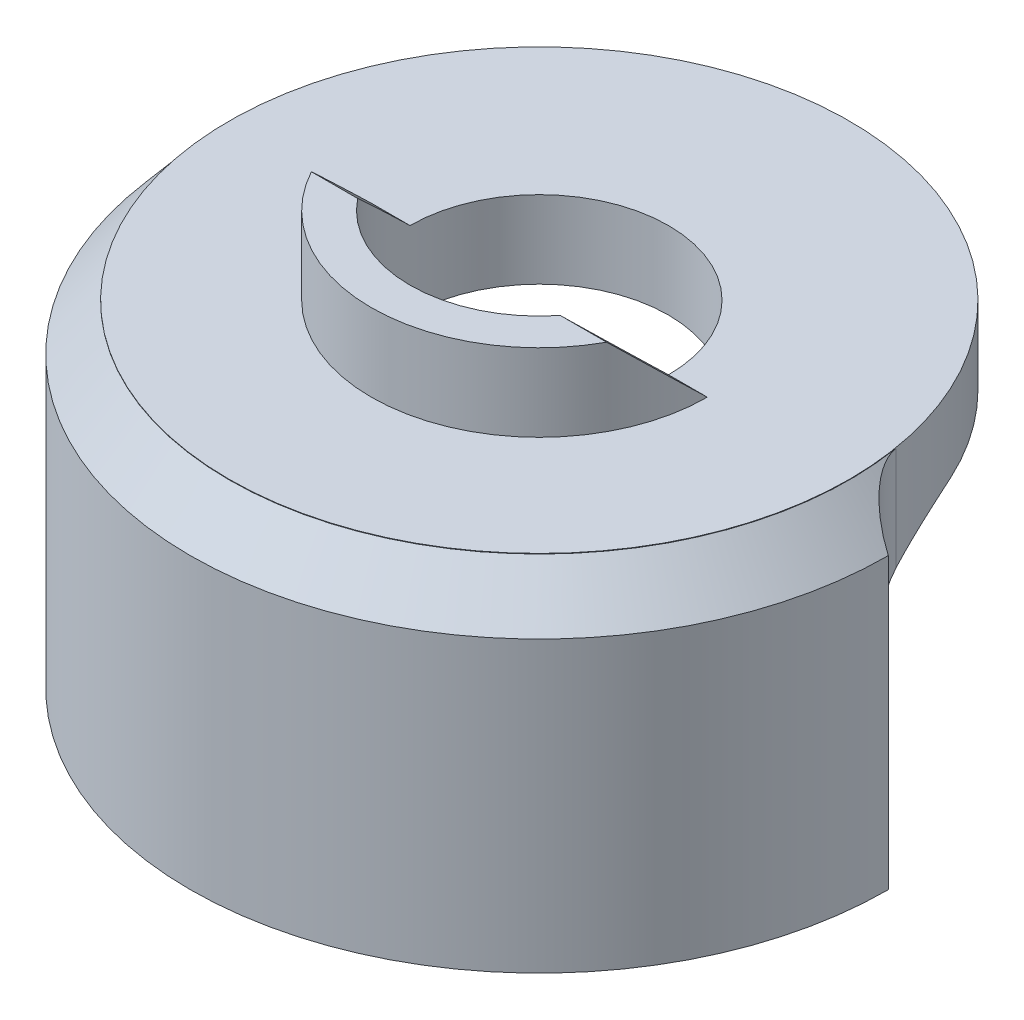
ISO-10303-21;
HEADER;
FILE_DESCRIPTION(('STEP AP214'),'2;1');
FILE_NAME('part.step','',(''),(''),'','','');
FILE_SCHEMA(('AUTOMOTIVE_DESIGN { 1 0 10303 214 1 1 1 1 }'));
ENDSEC;
DATA;
#1=APPLICATION_CONTEXT('core data for automotive mechanical design processes');
#2=APPLICATION_PROTOCOL_DEFINITION('international standard','automotive_design',2000,#1);
#3=PRODUCT_CONTEXT('',#1,'mechanical');
#4=PRODUCT('Part','Part','',(#3));
#5=PRODUCT_RELATED_PRODUCT_CATEGORY('part','',(#4));
#6=PRODUCT_DEFINITION_FORMATION('','',#4);
#7=PRODUCT_DEFINITION_CONTEXT('part definition',#1,'design');
#8=PRODUCT_DEFINITION('design','',#6,#7);
#9=PRODUCT_DEFINITION_SHAPE('','',#8);
#10=(LENGTH_UNIT() NAMED_UNIT(*) SI_UNIT(.MILLI.,.METRE.));
#11=(NAMED_UNIT(*) PLANE_ANGLE_UNIT() SI_UNIT($,.RADIAN.));
#12=(NAMED_UNIT(*) SI_UNIT($,.STERADIAN.) SOLID_ANGLE_UNIT());
#13=UNCERTAINTY_MEASURE_WITH_UNIT(LENGTH_MEASURE(1.E-05),#10,'distance_accuracy_value','');
#14=(GEOMETRIC_REPRESENTATION_CONTEXT(3) GLOBAL_UNCERTAINTY_ASSIGNED_CONTEXT((#13)) GLOBAL_UNIT_ASSIGNED_CONTEXT((#10,
#11,#12)) REPRESENTATION_CONTEXT('',''));
#15=CARTESIAN_POINT('',(0.,0.,0.));
#16=DIRECTION('',(0.,0.,1.));
#17=DIRECTION('',(1.,0.,0.));
#18=AXIS2_PLACEMENT_3D('',#15,#16,#17);
#19=CARTESIAN_POINT('',(0.,20.,0.));
#20=DIRECTION('',(0.,-1.,0.));
#21=DIRECTION('',(0.,0.,-1.));
#22=AXIS2_PLACEMENT_3D('',#19,#20,#21);
#23=CYLINDRICAL_SURFACE('',#22,20.);
#24=CARTESIAN_POINT('',(0.,0.,0.));
#25=DIRECTION('',(0.,-1.,0.));
#26=DIRECTION('',(0.,0.,-1.));
#27=AXIS2_PLACEMENT_3D('',#24,#25,#26);
#28=CIRCLE('',#27,20.);
#29=CARTESIAN_POINT('',(20.,0.,0.));
#30=VERTEX_POINT('',#29);
#31=CARTESIAN_POINT('',(-20.,0.,0.));
#32=VERTEX_POINT('',#31);
#33=EDGE_CURVE('E179',#30,#32,#28,.T.);
#34=ORIENTED_EDGE('',*,*,#33,.T.);
#35=DIRECTION('',(0.,-1.,0.));
#36=VECTOR('',#35,1.);
#37=CARTESIAN_POINT('',(-20.,20.,0.));
#38=LINE('',#37,#36);
#39=CARTESIAN_POINT('',(-20.,10.,0.));
#40=VERTEX_POINT('',#39);
#41=EDGE_CURVE('E212',#40,#32,#38,.T.);
#42=ORIENTED_EDGE('',*,*,#41,.F.);
#43=CARTESIAN_POINT('',(-20.,10.,0.));
#44=CARTESIAN_POINT('',(-19.9999557370953,10.2805626373853,2.99438579420407E-05));
#45=CARTESIAN_POINT('',(-19.9999986078176,10.5611210251892,-0.0118060572730352));
#46=CARTESIAN_POINT('',(-19.9999387337623,11.1202432263666,-0.0589939019382666));
#47=CARTESIAN_POINT('',(-19.9998359944431,11.3988071141145,-0.0943448639401672));
#48=CARTESIAN_POINT('',(-19.9991651639557,11.9518916713769,-0.188332355567513));
#49=CARTESIAN_POINT('',(-19.9985972139569,12.2264135417299,-0.246961818491314));
#50=CARTESIAN_POINT('',(-19.9963773522755,12.7695525530659,-0.387080348755986));
#51=CARTESIAN_POINT('',(-19.9947254540536,13.0381697673315,-0.468569132217736));
#52=CARTESIAN_POINT('',(-19.989522603102,13.5677616164803,-0.653886785261699));
#53=CARTESIAN_POINT('',(-19.9859704300935,13.8287312266746,-0.75772998429909));
#54=CARTESIAN_POINT('',(-19.9759617833958,14.3409674737002,-0.986968781670479));
#55=CARTESIAN_POINT('',(-19.9695053549892,14.5922342617499,-1.11236404394936));
#56=CARTESIAN_POINT('',(-19.9525359716774,15.0832085593254,-1.38375620847462));
#57=CARTESIAN_POINT('',(-19.9420234855485,15.3229174010533,-1.5297507287383));
#58=CARTESIAN_POINT('',(-19.9156807366992,15.7890239179821,-1.84121562157234));
#59=CARTESIAN_POINT('',(-19.8998505678017,16.0154218279526,-2.00668565049168));
#60=CARTESIAN_POINT('',(-19.8617485317303,16.4509585511862,-2.35396115093739));
#61=CARTESIAN_POINT('',(-19.8395441677449,16.6602501346368,-2.53558234570399));
#62=CARTESIAN_POINT('',(-19.7873511781658,17.0625518023257,-2.91502911047923));
#63=CARTESIAN_POINT('',(-19.7573625822775,17.2555619486918,-3.11285461864856));
#64=CARTESIAN_POINT('',(-19.6884046394683,17.6237303156232,-3.52276504570011));
#65=CARTESIAN_POINT('',(-19.6494418276717,17.7989013935786,-3.73483950912087));
#66=CARTESIAN_POINT('',(-19.5614292641474,18.1302973958213,-4.17133454832748));
#67=CARTESIAN_POINT('',(-19.5123799914951,18.286523219389,-4.3957545373687));
#68=CARTESIAN_POINT('',(-19.4055291021525,18.5730280044983,-4.8452651922289));
#69=CARTESIAN_POINT('',(-19.3481692420369,18.7041086431448,-5.06995042531682));
#70=CARTESIAN_POINT('',(-19.2227487020385,18.947317246645,-5.52647769706415));
#71=CARTESIAN_POINT('',(-19.154688097627,19.0594453451578,-5.75831968523834));
#72=CARTESIAN_POINT('',(-19.007432782435,19.2645281224053,-6.22719365358695));
#73=CARTESIAN_POINT('',(-18.9282267177046,19.3574630076423,-6.46423071549736));
#74=CARTESIAN_POINT('',(-18.7586219733123,19.5239993517451,-6.94104569878218));
#75=CARTESIAN_POINT('',(-18.6682242367918,19.597602438105,-7.18082338765561));
#76=CARTESIAN_POINT('',(-18.4852716379337,19.7198302561806,-7.63870144767883));
#77=CARTESIAN_POINT('',(-18.3936964321844,19.7701397092871,-7.85674735972424));
#78=CARTESIAN_POINT('',(-18.2016664772038,19.8555380220128,-8.29191863880495));
#79=CARTESIAN_POINT('',(-18.101211179975,19.8906259415087,-8.50904394816145));
#80=CARTESIAN_POINT('',(-17.8919969567306,19.9460956297941,-8.94056832620432));
#81=CARTESIAN_POINT('',(-17.7832558670354,19.9665080528281,-9.15497215325431));
#82=CARTESIAN_POINT('',(-17.5577747522793,19.9934653907493,-9.58033020860676));
#83=CARTESIAN_POINT('',(-17.4410375485944,20.0000151712221,-9.7912856214477));
#84=CARTESIAN_POINT('',(-17.3205080756888,20.,-10.));
#85=B_SPLINE_CURVE_WITH_KNOTS('',3,(#43,#44,#45,#46,#47,#48,#49,#50,#51,#52,#53,#54,#55,#56,#57,
#58,#59,#60,#61,#62,#63,#64,#65,#66,#67,#68,#69,#70,#71,#72,#73,#74,#75,#76,#77,#78,#79,#80,#81,
#82,#83,#84),.UNSPECIFIED.,.F.,.F.,(4,2,2,2,2,2,2,2,2,2,2,2,2,2,2,2,2,2,2,2,4),(0.,
0.841432372616263,1.68283320326807,2.5239788032209,3.36511395784561,4.20678990454419,
5.04845272842231,5.89001830677085,6.73156903767483,7.56451718005767,8.3974621438706,
9.22980245490532,10.0621032415009,10.8602498176647,11.6583907648246,12.4573507499772,
13.2562434511754,13.9809573838289,14.7057160704186,15.4289564442854,16.1519429291931),.UNSPECIFIED.);
#86=CARTESIAN_POINT('',(-17.3205080756888,20.,-10.));
#87=VERTEX_POINT('',#86);
#88=EDGE_CURVE('E309',#40,#87,#85,.T.);
#89=ORIENTED_EDGE('',*,*,#88,.T.);
#90=CARTESIAN_POINT('',(0.,20.,0.));
#91=DIRECTION('',(0.,-1.,0.));
#92=DIRECTION('',(0.,0.,-1.));
#93=AXIS2_PLACEMENT_3D('',#90,#91,#92);
#94=CIRCLE('',#93,20.);
#95=CARTESIAN_POINT('',(17.3205080756888,20.,-10.));
#96=VERTEX_POINT('',#95);
#97=EDGE_CURVE('E183',#96,#87,#94,.T.);
#98=ORIENTED_EDGE('',*,*,#97,.F.);
#99=CARTESIAN_POINT('',(17.3205080756888,20.,-10.));
#100=CARTESIAN_POINT('',(17.459612415594,20.0000289828941,-9.75915325547947));
#101=CARTESIAN_POINT('',(17.5936559303901,19.9912982661973,-9.51529333613806));
#102=CARTESIAN_POINT('',(17.8510321720107,19.9552269450601,-9.02315548704158));
#103=CARTESIAN_POINT('',(17.9743582486052,19.9278748776406,-8.77487492775037));
#104=CARTESIAN_POINT('',(18.2096966668275,19.853417275292,-8.27546730681568));
#105=CARTESIAN_POINT('',(18.3216934593926,19.8062850372674,-8.02433684540639));
#106=CARTESIAN_POINT('',(18.5336859705613,19.6914766887072,-7.52175613948921));
#107=CARTESIAN_POINT('',(18.633684333424,19.6238051163536,-7.27030597782845));
#108=CARTESIAN_POINT('',(18.8218407710521,19.4670902166285,-6.76834212011));
#109=CARTESIAN_POINT('',(18.9099483557127,19.3779599687156,-6.51783655304953));
#110=CARTESIAN_POINT('',(19.0738581333725,19.178327741808,-6.02131990188398));
#111=CARTESIAN_POINT('',(19.1496593574931,19.0678240815861,-5.7753091730089));
#112=CARTESIAN_POINT('',(19.2891545861386,18.8258796864667,-5.29074625413785));
#113=CARTESIAN_POINT('',(19.3528668826701,18.6944711461643,-5.05218325929775));
#114=CARTESIAN_POINT('',(19.4689275565784,18.4112143223625,-4.58463553736812));
#115=CARTESIAN_POINT('',(19.5212766296463,18.2593672910921,-4.35565022459722));
#116=CARTESIAN_POINT('',(19.6126912099352,17.9457410530995,-3.92280009919125));
#117=CARTESIAN_POINT('',(19.6523591542812,17.7850800902642,-3.71825052877837));
#118=CARTESIAN_POINT('',(19.7232936928387,17.4475068264008,-3.32149114715563));
#119=CARTESIAN_POINT('',(19.7545605865166,17.2705951049537,-3.12928089628083));
#120=CARTESIAN_POINT('',(19.8097149968838,16.9015743178438,-2.75868119688006));
#121=CARTESIAN_POINT('',(19.8335980592366,16.7094561662398,-2.58030013931035));
#122=CARTESIAN_POINT('',(19.8750343291867,16.3114025127017,-2.23888172518597));
#123=CARTESIAN_POINT('',(19.8925873914606,16.1054666936718,-2.07584472096174));
#124=CARTESIAN_POINT('',(19.9227019851648,15.6776728071139,-1.76378269350276));
#125=CARTESIAN_POINT('',(19.9351768619137,15.455608883857,-1.61503156933063));
#126=CARTESIAN_POINT('',(19.9558389477264,15.0001398792703,-1.33570692752737));
#127=CARTESIAN_POINT('',(19.9640260730185,14.7667345764565,-1.20513376508325));
#128=CARTESIAN_POINT('',(19.9771666714359,14.2901502617058,-0.963073362964122));
#129=CARTESIAN_POINT('',(19.9821201958237,14.0469714047744,-0.851585820744589));
#130=CARTESIAN_POINT('',(19.989743941604,13.5524334729352,-0.648439976445172));
#131=CARTESIAN_POINT('',(19.9924141652643,13.3010744061514,-0.556781654672759));
#132=CARTESIAN_POINT('',(19.9962189021077,12.8007565537338,-0.396755504012648));
#133=CARTESIAN_POINT('',(19.9974040220749,12.5520231169728,-0.327683189203374));
#134=CARTESIAN_POINT('',(19.9989958117031,12.0499618061518,-0.208973450337824));
#135=CARTESIAN_POINT('',(19.9994024966261,11.7966340222663,-0.159335645266042));
#136=CARTESIAN_POINT('',(19.9998827127155,11.2868679523363,-0.0797935346938616));
#137=CARTESIAN_POINT('',(19.9999562030292,11.0304292887339,-0.049891649383771));
#138=CARTESIAN_POINT('',(19.9999989843423,10.5159948291556,-0.00998366544209937));
#139=CARTESIAN_POINT('',(19.9999682696628,10.2579989490815,2.1348830103947E-05));
#140=CARTESIAN_POINT('',(20.,10.,0.));
#141=B_SPLINE_CURVE_WITH_KNOTS('',3,(#99,#100,#101,#102,#103,#104,#105,#106,#107,#108,#109,#110,
#111,#112,#113,#114,#115,#116,#117,#118,#119,#120,#121,#122,#123,#124,#125,#126,#127,#128,#129,
#130,#131,#132,#133,#134,#135,#136,#137,#138,#139,#140),.UNSPECIFIED.,.F.,.F.,(4,2,2,2,2,2,2,2,
2,2,2,2,2,2,2,2,2,2,2,2,4),(0.,0.834312350280989,1.66913875364591,2.50509581083416,
3.34086829694701,4.18008487221364,5.01936748690844,5.85736985767487,6.6953209089178,
7.48372262446205,8.27209623268631,9.06094450777076,9.84981089198667,10.6516249580703,
11.4534546889452,12.2552717080681,13.0570879308976,13.8307645145586,14.6044259294532,
15.378182199828,16.1519806379827),.UNSPECIFIED.);
#142=CARTESIAN_POINT('',(20.,10.,0.));
#143=VERTEX_POINT('',#142);
#144=EDGE_CURVE('E269',#96,#143,#141,.T.);
#145=ORIENTED_EDGE('',*,*,#144,.T.);
#146=DIRECTION('',(0.,-1.,0.));
#147=VECTOR('',#146,1.);
#148=CARTESIAN_POINT('',(20.,20.,0.));
#149=LINE('',#148,#147);
#150=EDGE_CURVE('E186',#143,#30,#149,.T.);
#151=ORIENTED_EDGE('',*,*,#150,.T.);
#152=EDGE_LOOP('',(#34,#42,#89,#98,#145,#151));
#153=FACE_BOUND('',#152,.T.);
#154=ADVANCED_FACE('F45',(#153),#23,.F.);
#155=CARTESIAN_POINT('',(-27.,20.,0.));
#156=DIRECTION('',(0.,0.,1.));
#157=DIRECTION('',(1.,0.,0.));
#158=AXIS2_PLACEMENT_3D('',#155,#156,#157);
#159=PLANE('',#158);
#160=DIRECTION('',(0.,-1.,0.));
#161=VECTOR('',#160,1.);
#162=CARTESIAN_POINT('',(-27.,20.,0.));
#163=LINE('',#162,#161);
#164=CARTESIAN_POINT('',(-27.,10.,0.));
#165=VERTEX_POINT('',#164);
#166=CARTESIAN_POINT('',(-27.,0.,0.));
#167=VERTEX_POINT('',#166);
#168=EDGE_CURVE('E208',#165,#167,#163,.T.);
#169=ORIENTED_EDGE('',*,*,#168,.F.);
#170=DIRECTION('',(-1.,0.,0.));
#171=VECTOR('',#170,1.);
#172=CARTESIAN_POINT('',(-20.,10.,0.));
#173=LINE('',#172,#171);
#174=EDGE_CURVE('E542',#165,#40,#173,.F.);
#175=ORIENTED_EDGE('',*,*,#174,.T.);
#176=ORIENTED_EDGE('',*,*,#41,.T.);
#177=DIRECTION('',(-1.,0.,0.));
#178=VECTOR('',#177,1.);
#179=CARTESIAN_POINT('',(-27.,0.,0.));
#180=LINE('',#179,#178);
#181=EDGE_CURVE('E191',#32,#167,#180,.T.);
#182=ORIENTED_EDGE('',*,*,#181,.T.);
#183=EDGE_LOOP('',(#169,#175,#176,#182));
#184=FACE_BOUND('',#183,.T.);
#185=ADVANCED_FACE('F322',(#184),#159,.F.);
#186=CARTESIAN_POINT('',(0.,20.,0.));
#187=DIRECTION('',(0.,-1.,0.));
#188=DIRECTION('',(0.,0.,-1.));
#189=AXIS2_PLACEMENT_3D('',#186,#187,#188);
#190=CYLINDRICAL_SURFACE('',#189,27.);
#191=CARTESIAN_POINT('',(0.,0.,0.));
#192=DIRECTION('',(0.,1.,0.));
#193=DIRECTION('',(0.,0.,1.));
#194=AXIS2_PLACEMENT_3D('',#191,#192,#193);
#195=CIRCLE('',#194,27.);
#196=CARTESIAN_POINT('',(27.,0.,0.));
#197=VERTEX_POINT('',#196);
#198=EDGE_CURVE('E195',#167,#197,#195,.T.);
#199=ORIENTED_EDGE('',*,*,#198,.T.);
#200=DIRECTION('',(0.,-1.,0.));
#201=VECTOR('',#200,1.);
#202=CARTESIAN_POINT('',(27.,20.,0.));
#203=LINE('',#202,#201);
#204=CARTESIAN_POINT('',(27.,10.,0.));
#205=VERTEX_POINT('',#204);
#206=EDGE_CURVE('E204',#205,#197,#203,.T.);
#207=ORIENTED_EDGE('',*,*,#206,.F.);
#208=CARTESIAN_POINT('',(27.,22.3835071851885,0.));
#209=VERTEX_POINT('',#208);
#210=EDGE_CURVE('E205',#209,#205,#203,.T.);
#211=ORIENTED_EDGE('',*,*,#210,.F.);
#212=CARTESIAN_POINT('',(0.,22.3835071851885,0.));
#213=DIRECTION('',(0.,-1.,0.));
#214=DIRECTION('',(0.,0.,-1.));
#215=AXIS2_PLACEMENT_3D('',#212,#213,#214);
#216=CIRCLE('',#215,27.);
#217=CARTESIAN_POINT('',(-27.,22.3835071851885,0.));
#218=VERTEX_POINT('',#217);
#219=EDGE_CURVE('E218',#209,#218,#216,.T.);
#220=ORIENTED_EDGE('',*,*,#219,.T.);
#221=EDGE_CURVE('E209',#218,#165,#163,.T.);
#222=ORIENTED_EDGE('',*,*,#221,.T.);
#223=ORIENTED_EDGE('',*,*,#168,.T.);
#224=EDGE_LOOP('',(#199,#207,#211,#220,#222,#223));
#225=FACE_BOUND('',#224,.T.);
#226=ADVANCED_FACE('F327',(#225),#190,.T.);
#227=CARTESIAN_POINT('',(20.,20.,0.));
#228=DIRECTION('',(0.,0.,1.));
#229=DIRECTION('',(1.,0.,0.));
#230=AXIS2_PLACEMENT_3D('',#227,#228,#229);
#231=PLANE('',#230);
#232=ORIENTED_EDGE('',*,*,#150,.F.);
#233=DIRECTION('',(-1.,0.,0.));
#234=VECTOR('',#233,1.);
#235=CARTESIAN_POINT('',(27.,10.,0.));
#236=LINE('',#235,#234);
#237=EDGE_CURVE('E546',#143,#205,#236,.F.);
#238=ORIENTED_EDGE('',*,*,#237,.T.);
#239=ORIENTED_EDGE('',*,*,#206,.T.);
#240=DIRECTION('',(-1.,0.,0.));
#241=VECTOR('',#240,1.);
#242=CARTESIAN_POINT('',(20.,0.,0.));
#243=LINE('',#242,#241);
#244=EDGE_CURVE('E187',#197,#30,#243,.T.);
#245=ORIENTED_EDGE('',*,*,#244,.T.);
#246=EDGE_LOOP('',(#232,#238,#239,#245));
#247=FACE_BOUND('',#246,.T.);
#248=ADVANCED_FACE('F331',(#247),#231,.F.);
#249=CARTESIAN_POINT('',(0.,0.,0.));
#250=DIRECTION('',(0.,-1.,0.));
#251=DIRECTION('',(0.,0.,-1.));
#252=AXIS2_PLACEMENT_3D('',#249,#250,#251);
#253=PLANE('',#252);
#254=ORIENTED_EDGE('',*,*,#33,.F.);
#255=ORIENTED_EDGE('',*,*,#244,.F.);
#256=ORIENTED_EDGE('',*,*,#198,.F.);
#257=ORIENTED_EDGE('',*,*,#181,.F.);
#258=EDGE_LOOP('',(#254,#255,#256,#257));
#259=FACE_BOUND('',#258,.T.);
#260=ADVANCED_FACE('F335',(#259),#253,.T.);
#261=CARTESIAN_POINT('',(0.,20.,0.));
#262=DIRECTION('',(0.,1.,0.));
#263=DIRECTION('',(0.,0.,1.));
#264=AXIS2_PLACEMENT_3D('',#261,#262,#263);
#265=PLANE('',#264);
#266=CARTESIAN_POINT('',(0.,20.,0.));
#267=DIRECTION('',(0.,1.,0.));
#268=DIRECTION('',(0.,0.,1.));
#269=AXIS2_PLACEMENT_3D('',#266,#267,#268);
#270=CIRCLE('',#269,10.);
#271=CARTESIAN_POINT('',(0.,20.,10.));
#272=VERTEX_POINT('',#271);
#273=EDGE_CURVE('E157',#272,#272,#270,.F.);
#274=ORIENTED_EDGE('',*,*,#273,.F.);
#275=EDGE_LOOP('',(#274));
#276=FACE_BOUND('',#275,.T.);
#277=CARTESIAN_POINT('',(0.,20.,0.));
#278=DIRECTION('',(0.,1.,0.));
#279=DIRECTION('',(0.,0.,1.));
#280=AXIS2_PLACEMENT_3D('',#277,#278,#279);
#281=CIRCLE('',#280,24.);
#282=CARTESIAN_POINT('',(21.8174242292714,20.,-10.));
#283=VERTEX_POINT('',#282);
#284=CARTESIAN_POINT('',(-21.8174242292714,20.,-10.));
#285=VERTEX_POINT('',#284);
#286=EDGE_CURVE('E174',#283,#285,#281,.T.);
#287=ORIENTED_EDGE('',*,*,#286,.F.);
#288=DIRECTION('',(-1.,0.,0.));
#289=VECTOR('',#288,1.);
#290=CARTESIAN_POINT('',(20.,20.,-10.));
#291=LINE('',#290,#289);
#292=EDGE_CURVE('E550',#283,#96,#291,.T.);
#293=ORIENTED_EDGE('',*,*,#292,.T.);
#294=ORIENTED_EDGE('',*,*,#97,.T.);
#295=DIRECTION('',(-1.,0.,0.));
#296=VECTOR('',#295,1.);
#297=CARTESIAN_POINT('',(-27.,20.,-10.));
#298=LINE('',#297,#296);
#299=EDGE_CURVE('E534',#87,#285,#298,.T.);
#300=ORIENTED_EDGE('',*,*,#299,.T.);
#301=EDGE_LOOP('',(#287,#293,#294,#300));
#302=FACE_BOUND('',#301,.T.);
#303=ADVANCED_FACE('F338',(#276,#302),#265,.F.);
#304=CARTESIAN_POINT('',(0.,26.,0.));
#305=DIRECTION('',(0.,-1.,0.));
#306=DIRECTION('',(0.,0.,-1.));
#307=AXIS2_PLACEMENT_3D('',#304,#305,#306);
#308=CYLINDRICAL_SURFACE('',#307,24.);
#309=CARTESIAN_POINT('',(0.,26.,0.));
#310=DIRECTION('',(0.,1.,0.));
#311=DIRECTION('',(0.,0.,1.));
#312=AXIS2_PLACEMENT_3D('',#309,#310,#311);
#313=CIRCLE('',#312,24.);
#314=CARTESIAN_POINT('',(0.,26.,24.));
#315=VERTEX_POINT('',#314);
#316=EDGE_CURVE('E175',#315,#315,#313,.T.);
#317=ORIENTED_EDGE('',*,*,#316,.F.);
#318=EDGE_LOOP('',(#317));
#319=FACE_BOUND('',#318,.T.);
#320=CARTESIAN_POINT('',(0.,25.9587679629712,0.));
#321=DIRECTION('',(0.,-1.,0.));
#322=DIRECTION('',(0.,0.,-1.));
#323=AXIS2_PLACEMENT_3D('',#320,#321,#322);
#324=CIRCLE('',#323,24.);
#325=CARTESIAN_POINT('',(-23.6781609195402,25.9587679629712,-3.91723058656978));
#326=VERTEX_POINT('',#325);
#327=CARTESIAN_POINT('',(23.6781609195402,25.9587679629712,-3.91723058656978));
#328=VERTEX_POINT('',#327);
#329=EDGE_CURVE('E215',#326,#328,#324,.F.);
#330=ORIENTED_EDGE('',*,*,#329,.T.);
#331=DIRECTION('',(0.,-1.,0.));
#332=VECTOR('',#331,1.);
#333=CARTESIAN_POINT('',(23.6781609195402,26.,-3.91723058656978));
#334=LINE('',#333,#332);
#335=CARTESIAN_POINT('',(23.6781609195402,17.9372486582592,-3.91723058656978));
#336=VERTEX_POINT('',#335);
#337=EDGE_CURVE('E226',#328,#336,#334,.T.);
#338=ORIENTED_EDGE('',*,*,#337,.T.);
#339=CARTESIAN_POINT('',(23.6781609195402,17.9372486582592,-3.91723058656978));
#340=CARTESIAN_POINT('',(23.6602250004101,18.0203368719418,-4.02564911704983));
#341=CARTESIAN_POINT('',(23.6412610729326,18.1011092262715,-4.13565007670976));
#342=CARTESIAN_POINT('',(23.6011748353439,18.2579149320483,-4.35859794492915));
#343=CARTESIAN_POINT('',(23.5800525115848,18.3339482535249,-4.47154487211298));
#344=CARTESIAN_POINT('',(23.5133126208748,18.5547181043687,-4.81438236611521));
#345=CARTESIAN_POINT('',(23.4643078967524,18.6921914053207,-5.04835705090066));
#346=CARTESIAN_POINT('',(23.3582171862088,18.9432664918428,-5.51815570586701));
#347=CARTESIAN_POINT('',(23.3013997135546,19.0574345796938,-5.75373916498655));
#348=CARTESIAN_POINT('',(23.1783333613284,19.2662082980369,-6.23101837513728));
#349=CARTESIAN_POINT('',(23.112084890047,19.3608147749639,-6.47271386119174));
#350=CARTESIAN_POINT('',(22.9633946844892,19.538132585637,-6.98279540713525));
#351=CARTESIAN_POINT('',(22.8800209436787,19.6189268771735,-7.25157787295736));
#352=CARTESIAN_POINT('',(22.7018557972425,19.7570471570442,-7.79144419074444));
#353=CARTESIAN_POINT('',(22.6070606141325,19.8143653532575,-8.06252877639771));
#354=CARTESIAN_POINT('',(22.4031635796348,19.9074314891828,-8.61319610278034));
#355=CARTESIAN_POINT('',(22.2937007072249,19.9424296352294,-8.89277289490351));
#356=CARTESIAN_POINT('',(22.1211885286794,19.977142047312,-9.30997894841595));
#357=CARTESIAN_POINT('',(22.0623077135226,19.9857487593338,-9.44866691654882));
#358=CARTESIAN_POINT('',(21.9418602175512,19.9971772816527,-9.72509652971378));
#359=CARTESIAN_POINT('',(21.8802938011427,19.9999996601293,-9.8628382663668));
#360=CARTESIAN_POINT('',(21.8174242292714,20.,-10.));
#361=B_SPLINE_CURVE_WITH_KNOTS('',3,(#339,#340,#341,#342,#343,#344,#345,#346,#347,#348,#349,
#350,#351,#352,#353,#354,#355,#356,#357,#358,#359,#360),.UNSPECIFIED.,.F.,.F.,(4,2,2,2,2,2,2,2,
2,2,4),(0.,0.413235257339747,0.826473127779158,1.65261707161379,2.45533802552638,
3.25802423827354,4.1351571314558,5.01258092470106,5.91811188389146,6.37074015356759,
6.82332396066914),.UNSPECIFIED.);
#362=EDGE_CURVE('E268',#336,#283,#361,.T.);
#363=ORIENTED_EDGE('',*,*,#362,.T.);
#364=ORIENTED_EDGE('',*,*,#286,.T.);
#365=CARTESIAN_POINT('',(-21.8174242292714,20.,-10.));
#366=CARTESIAN_POINT('',(-21.9354885422068,20.0000340373918,-9.74251935151873));
#367=CARTESIAN_POINT('',(-22.0489443941465,19.9900553733653,-9.48285094585129));
#368=CARTESIAN_POINT('',(-22.2661261450824,19.9493103627414,-8.9609697713506));
#369=CARTESIAN_POINT('',(-22.3698479575053,19.9185353294201,-8.69875598443165));
#370=CARTESIAN_POINT('',(-22.5640743261323,19.8366460092279,-8.18148947109453));
#371=CARTESIAN_POINT('',(-22.6548761685531,19.7861511878118,-7.92645096520169));
#372=CARTESIAN_POINT('',(-22.8264206465051,19.6644452234956,-7.41798255435075));
#373=CARTESIAN_POINT('',(-22.9071650990481,19.5932378303944,-7.16455236670159));
#374=CARTESIAN_POINT('',(-23.0612427380383,19.4269842410977,-6.65230583690256));
#375=CARTESIAN_POINT('',(-23.1342028657491,19.331169859861,-6.39362560536962));
#376=CARTESIAN_POINT('',(-23.2693695580381,19.1172728945167,-5.88271205430811));
#377=CARTESIAN_POINT('',(-23.3315746836787,18.9991873351072,-5.63047960128427));
#378=CARTESIAN_POINT('',(-23.4473918574339,18.737220679108,-5.12723157041414));
#379=CARTESIAN_POINT('',(-23.5006778259875,18.5926535271824,-4.8764959960584));
#380=CARTESIAN_POINT('',(-23.5728592673081,18.3591771865314,-4.50953368694456));
#381=CARTESIAN_POINT('',(-23.5956324919129,18.2785619965969,-4.38871184247738));
#382=CARTESIAN_POINT('',(-23.6387142521204,18.1119266665627,-4.15040331459139));
#383=CARTESIAN_POINT('',(-23.6590228084477,18.02590657192,-4.03291660313501));
#384=CARTESIAN_POINT('',(-23.6781609195402,17.9372486582592,-3.91723058656978));
#385=B_SPLINE_CURVE_WITH_KNOTS('',3,(#365,#366,#367,#368,#369,#370,#371,#372,#373,#374,#375,
#376,#377,#378,#379,#380,#381,#382,#383,#384),.UNSPECIFIED.,.F.,.F.,(4,2,2,2,2,2,2,2,2,4),(0.,
0.849657346845772,1.69966981840929,2.52488806769535,3.34995701255762,4.20482870606675,
5.05981468654479,5.94129939705155,6.38222828318949,6.82315346145854),.UNSPECIFIED.);
#386=CARTESIAN_POINT('',(-23.6781609195402,17.9372486582592,-3.91723058656978));
#387=VERTEX_POINT('',#386);
#388=EDGE_CURVE('E295',#285,#387,#385,.T.);
#389=ORIENTED_EDGE('',*,*,#388,.T.);
#390=DIRECTION('',(0.,-1.,0.));
#391=VECTOR('',#390,1.);
#392=CARTESIAN_POINT('',(-23.6781609195402,26.,-3.91723058656978));
#393=LINE('',#392,#391);
#394=EDGE_CURVE('E222',#387,#326,#393,.F.);
#395=ORIENTED_EDGE('',*,*,#394,.T.);
#396=EDGE_LOOP('',(#330,#338,#363,#364,#389,#395));
#397=FACE_BOUND('',#396,.T.);
#398=ADVANCED_FACE('F340',(#319,#397),#308,.T.);
#399=CARTESIAN_POINT('',(0.,26.,0.));
#400=DIRECTION('',(0.,1.,0.));
#401=DIRECTION('',(0.,0.,1.));
#402=AXIS2_PLACEMENT_3D('',#399,#400,#401);
#403=PLANE('',#402);
#404=DIRECTION('',(-1.,0.,0.));
#405=VECTOR('',#404,1.);
#406=CARTESIAN_POINT('',(-10.,26.,0.));
#407=LINE('',#406,#405);
#408=CARTESIAN_POINT('',(-10.,26.,0.));
#409=VERTEX_POINT('',#408);
#410=CARTESIAN_POINT('',(-13.,26.,0.));
#411=VERTEX_POINT('',#410);
#412=EDGE_CURVE('E155',#409,#411,#407,.T.);
#413=ORIENTED_EDGE('',*,*,#412,.F.);
#414=CARTESIAN_POINT('',(0.,26.,0.));
#415=DIRECTION('',(0.,1.,0.));
#416=DIRECTION('',(0.,0.,1.));
#417=AXIS2_PLACEMENT_3D('',#414,#415,#416);
#418=CIRCLE('',#417,10.);
#419=CARTESIAN_POINT('',(10.,26.,0.));
#420=VERTEX_POINT('',#419);
#421=EDGE_CURVE('E144',#420,#409,#418,.T.);
#422=ORIENTED_EDGE('',*,*,#421,.F.);
#423=DIRECTION('',(-1.,0.,0.));
#424=VECTOR('',#423,1.);
#425=CARTESIAN_POINT('',(13.,26.,0.));
#426=LINE('',#425,#424);
#427=CARTESIAN_POINT('',(13.,26.,0.));
#428=VERTEX_POINT('',#427);
#429=EDGE_CURVE('E152',#428,#420,#426,.T.);
#430=ORIENTED_EDGE('',*,*,#429,.F.);
#431=CARTESIAN_POINT('',(0.,26.,0.));
#432=DIRECTION('',(0.,1.,0.));
#433=DIRECTION('',(0.,0.,1.));
#434=AXIS2_PLACEMENT_3D('',#431,#432,#433);
#435=CIRCLE('',#434,13.);
#436=EDGE_CURVE('E162',#411,#428,#435,.T.);
#437=ORIENTED_EDGE('',*,*,#436,.F.);
#438=EDGE_LOOP('',(#413,#422,#430,#437));
#439=FACE_BOUND('',#438,.T.);
#440=ORIENTED_EDGE('',*,*,#316,.T.);
#441=EDGE_LOOP('',(#440));
#442=FACE_BOUND('',#441,.T.);
#443=ADVANCED_FACE('F149',(#439,#442),#403,.T.);
#444=CARTESIAN_POINT('',(0.,25.9587679629712,0.));
#445=DIRECTION('',(0.,-1.,0.));
#446=DIRECTION('',(0.,0.,-1.));
#447=AXIS2_PLACEMENT_3D('',#444,#445,#446);
#448=CONICAL_SURFACE('',#447,24.,0.698131700797727);
#449=ORIENTED_EDGE('',*,*,#329,.F.);
#450=CARTESIAN_POINT('',(-23.6781609195402,25.9587679629712,-3.91723058656978));
#451=CARTESIAN_POINT('',(-23.6947141090822,25.9588213305374,-3.8169632536977));
#452=CARTESIAN_POINT('',(-23.7143837134009,25.9543084110862,-3.71725147613824));
#453=CARTESIAN_POINT('',(-23.7594930707125,25.9365666247173,-3.52009290938226));
#454=CARTESIAN_POINT('',(-23.7849235690718,25.9233516730227,-3.42264276079586));
#455=CARTESIAN_POINT('',(-23.8407578638009,25.8888607733229,-3.23216460012225));
#456=CARTESIAN_POINT('',(-23.8710878283143,25.8676991141838,-3.1390940122802));
#457=CARTESIAN_POINT('',(-23.9364112761541,25.8179770117111,-2.95664333615477));
#458=CARTESIAN_POINT('',(-23.9714062779042,25.7894141564924,-2.86726446194764));
#459=CARTESIAN_POINT('',(-24.0820657230795,25.6941479250592,-2.60654366683007));
#460=CARTESIAN_POINT('',(-24.1638049836672,25.617608775281,-2.44129078389896));
#461=CARTESIAN_POINT('',(-24.3394465497093,25.4441932059517,-2.12845777560281));
#462=CARTESIAN_POINT('',(-24.4333919564813,25.3472439252907,-1.98094402315404));
#463=CARTESIAN_POINT('',(-24.6116205177155,25.1578777934892,-1.72946043552559));
#464=CARTESIAN_POINT('',(-24.6944387979956,25.0679868256481,-1.62250018159858));
#465=CARTESIAN_POINT('',(-24.8646096491892,24.8803874592986,-1.41951841304552));
#466=CARTESIAN_POINT('',(-24.9519648956497,24.7826744291374,-1.32350346220963));
#467=CARTESIAN_POINT('',(-25.1305417681457,24.5807823336822,-1.14139005567262));
#468=CARTESIAN_POINT('',(-25.2217770206973,24.4765797584899,-1.05533132107937));
#469=CARTESIAN_POINT('',(-25.4071033638097,24.2633268207812,-0.892809185839583));
#470=CARTESIAN_POINT('',(-25.501195182991,24.154275218078,-0.81634825926658));
#471=CARTESIAN_POINT('',(-25.709421197054,23.9116782816801,-0.658978808517197));
#472=CARTESIAN_POINT('',(-25.824024079506,23.7773541548811,-0.579894674162445));
#473=CARTESIAN_POINT('',(-26.0558179233783,23.5045739982797,-0.433404937362757));
#474=CARTESIAN_POINT('',(-26.1730098728175,23.3661163837522,-0.366003883248423));
#475=CARTESIAN_POINT('',(-26.4076927912789,23.088146607821,-0.243080630659132));
#476=CARTESIAN_POINT('',(-26.5251542140276,22.9486796302812,-0.187398836632481));
#477=CARTESIAN_POINT('',(-26.7615433070388,22.6675783390156,-0.0862201824644151));
#478=CARTESIAN_POINT('',(-26.8804692872358,22.525946484919,-0.0407125661855508));
#479=CARTESIAN_POINT('',(-27.,22.3835071851885,0.));
#480=B_SPLINE_CURVE_WITH_KNOTS('',3,(#450,#451,#452,#453,#454,#455,#456,#457,#458,#459,#460,
#461,#462,#463,#464,#465,#466,#467,#468,#469,#470,#471,#472,#473,#474,#475,#476,#477,#478,#479),
.UNSPECIFIED.,.F.,.F.,(4,2,2,2,2,2,2,2,2,2,2,2,2,2,4),(0.,0.30466195275696,0.608837906681413,
0.908797084219574,1.20885413498726,1.80480185932233,2.4029142407238,2.8894963020483,
3.3763686436219,3.86512089955223,4.35399888592174,4.93393847250811,5.51410333028451,
6.08576665818694,6.65682273550526),.UNSPECIFIED.);
#481=EDGE_CURVE('E239',#326,#218,#480,.T.);
#482=ORIENTED_EDGE('',*,*,#481,.T.);
#483=ORIENTED_EDGE('',*,*,#219,.F.);
#484=CARTESIAN_POINT('',(27.,22.3835071851885,0.));
#485=CARTESIAN_POINT('',(26.918449250416,22.4806939858123,-0.0277628960497316));
#486=CARTESIAN_POINT('',(26.8371964094848,22.5774781955349,-0.0577660075404999));
#487=CARTESIAN_POINT('',(26.6753594297343,22.7700880065515,-0.122412638293526));
#488=CARTESIAN_POINT('',(26.5947754424115,22.8659133916283,-0.157057179946159));
#489=CARTESIAN_POINT('',(26.3535234706521,23.1524485241849,-0.268481030839521));
#490=CARTESIAN_POINT('',(26.1940349191792,23.341406419179,-0.352522497655824));
#491=CARTESIAN_POINT('',(25.8772857978647,23.7149468717021,-0.542757602067201));
#492=CARTESIAN_POINT('',(25.7200847014583,23.8994354476754,-0.649235976775756));
#493=CARTESIAN_POINT('',(25.41205551277,24.2579086037433,-0.885765352528304));
#494=CARTESIAN_POINT('',(25.2612150620152,24.4319138642171,-1.01576777306471));
#495=CARTESIAN_POINT('',(25.0523397650968,24.6693475866266,-1.22009385336426));
#496=CARTESIAN_POINT('',(24.9906800352511,24.7389751396189,-1.28360591111946));
#497=CARTESIAN_POINT('',(24.8692461454165,24.8749716128039,-1.4157163712729));
#498=CARTESIAN_POINT('',(24.8094719661164,24.9413405663742,-1.48431472155448));
#499=CARTESIAN_POINT('',(24.6336263751288,25.1345283313901,-1.69792031480031));
#500=CARTESIAN_POINT('',(24.5208151959041,25.2556757473747,-1.85094624288879));
#501=CARTESIAN_POINT('',(24.3061651175466,25.4781033223587,-2.18247092221892));
#502=CARTESIAN_POINT('',(24.2045038932351,25.5790783832852,-2.36129922047333));
#503=CARTESIAN_POINT('',(24.0662416382908,25.7071848859354,-2.64638718661374));
#504=CARTESIAN_POINT('',(24.0225791509177,25.7459547828776,-2.74406950143252));
#505=CARTESIAN_POINT('',(23.9407361067746,25.8146570008631,-2.94465607155414));
#506=CARTESIAN_POINT('',(23.9025520852545,25.844594920288,-3.04755697022658));
#507=CARTESIAN_POINT('',(23.8267733541671,25.8986269470929,-3.27500606029226));
#508=CARTESIAN_POINT('',(23.7902828654383,25.9209806941529,-3.40035456395022));
#509=CARTESIAN_POINT('',(23.7427200366507,25.9435472671519,-3.59176686448986));
#510=CARTESIAN_POINT('',(23.7280268522845,25.9492425646592,-3.6563420017071));
#511=CARTESIAN_POINT('',(23.7011710228565,25.9568567854438,-3.78627433764414));
#512=CARTESIAN_POINT('',(23.6890098109168,25.9587735752164,-3.85163195724636));
#513=CARTESIAN_POINT('',(23.6781609195402,25.9587679629712,-3.91723058656978));
#514=B_SPLINE_CURVE_WITH_KNOTS('',3,(#484,#485,#486,#487,#488,#489,#490,#491,#492,#493,#494,
#495,#496,#497,#498,#499,#500,#501,#502,#503,#504,#505,#506,#507,#508,#509,#510,#511,#512,#513),
.UNSPECIFIED.,.F.,.F.,(4,2,2,2,2,2,2,2,2,2,2,2,2,2,4),(0.,0.389570899272188,0.779227752744929,
1.56177983947379,2.35493572049906,3.14647193707719,3.48418684003144,3.82189828307066,
4.49616031282955,5.17995504409374,5.52086000324987,5.86154840420541,6.25760288523167,
6.45687318120624,6.65625596139341),.UNSPECIFIED.);
#515=EDGE_CURVE('E229',#209,#328,#514,.T.);
#516=ORIENTED_EDGE('',*,*,#515,.T.);
#517=EDGE_LOOP('',(#449,#482,#483,#516));
#518=FACE_BOUND('',#517,.T.);
#519=ADVANCED_FACE('F247',(#518),#448,.T.);
#520=CARTESIAN_POINT('',(28.6111111111111,20.,-4.73332029210515));
#521=DIRECTION('',(0.,1.,0.));
#522=DIRECTION('',(0.,0.,1.));
#523=AXIS2_PLACEMENT_3D('',#520,#521,#522);
#524=CYLINDRICAL_SURFACE('',#523,5.);
#525=ORIENTED_EDGE('',*,*,#515,.F.);
#526=ORIENTED_EDGE('',*,*,#210,.T.);
#527=CARTESIAN_POINT('',(27.,10.,0.));
#528=CARTESIAN_POINT('',(27.0002191640993,10.1225245675793,2.6218927826959E-05));
#529=CARTESIAN_POINT('',(26.9933805377593,10.2448663302592,-0.00225036548078424));
#530=CARTESIAN_POINT('',(26.9674721106438,10.4875511545453,-0.0111649770936654));
#531=CARTESIAN_POINT('',(26.9484582819047,10.6079007902994,-0.0177830489319627));
#532=CARTESIAN_POINT('',(26.900440101632,10.8441984636752,-0.0350013703200181));
#533=CARTESIAN_POINT('',(26.8716006688198,10.9601861278483,-0.0455361305468448));
#534=CARTESIAN_POINT('',(26.8061467035503,11.1896571076608,-0.0703452300624813));
#535=CARTESIAN_POINT('',(26.7695219613306,11.303136916602,-0.0846244857360782));
#536=CARTESIAN_POINT('',(26.6909012580587,11.5264382076481,-0.116549648128636));
#537=CARTESIAN_POINT('',(26.6489611317811,11.636284566905,-0.134161382310963));
#538=CARTESIAN_POINT('',(26.5609748068052,11.8537416908997,-0.172699794287503));
#539=CARTESIAN_POINT('',(26.5149274468556,11.9613518127079,-0.19362741089853));
#540=CARTESIAN_POINT('',(26.3724454897391,12.2813311333678,-0.261255389812487));
#541=CARTESIAN_POINT('',(26.2717033168022,12.4907637463811,-0.312788423775996));
#542=CARTESIAN_POINT('',(26.0638309087202,12.9062156732135,-0.42915819674769));
#543=CARTESIAN_POINT('',(25.9566340243549,13.1121537270095,-0.49416118180517));
#544=CARTESIAN_POINT('',(25.7410390469384,13.5187488413058,-0.637051598099662));
#545=CARTESIAN_POINT('',(25.6326414412846,13.7194079405147,-0.714933968128252));
#546=CARTESIAN_POINT('',(25.3948233438084,14.1575458510759,-0.901496202032866));
#547=CARTESIAN_POINT('',(25.2657550686415,14.3939335191442,-1.01320994578997));
#548=CARTESIAN_POINT('',(25.0136742064824,14.8598409516708,-1.2563738707815));
#549=CARTESIAN_POINT('',(24.8906635933294,15.0893584681179,-1.3878304292801));
#550=CARTESIAN_POINT('',(24.6552498591361,15.5388630692667,-1.66988777113154));
#551=CARTESIAN_POINT('',(24.542766166733,15.7589141131636,-1.82031809713679));
#552=CARTESIAN_POINT('',(24.3309387630738,16.1901061756253,-2.14157371880084));
#553=CARTESIAN_POINT('',(24.2315878075196,16.401252062322,-2.31238767062758));
#554=CARTESIAN_POINT('',(24.0360205614087,16.8447181691293,-2.70275326400129));
#555=CARTESIAN_POINT('',(23.942628261075,17.0753111281784,-2.92576117167155));
#556=CARTESIAN_POINT('',(23.8249466377307,17.4084875382116,-3.28129407900236));
#557=CARTESIAN_POINT('',(23.7893566823977,17.5178408055979,-3.40384372861649));
#558=CARTESIAN_POINT('',(23.7269142186248,17.7315026329403,-3.65561823096428));
#559=CARTESIAN_POINT('',(23.7000711500195,17.8358056398999,-3.78485012224851));
#560=CARTESIAN_POINT('',(23.6781609195402,17.9372486582592,-3.91723058656978));
#561=B_SPLINE_CURVE_WITH_KNOTS('',3,(#527,#528,#529,#530,#531,#532,#533,#534,#535,#536,#537,
#538,#539,#540,#541,#542,#543,#544,#545,#546,#547,#548,#549,#550,#551,#552,#553,#554,#555,#556,
#557,#558,#559,#560),.UNSPECIFIED.,.F.,.F.,(4,2,2,2,2,2,2,2,2,2,2,2,2,2,2,2,4),(0.,
0.367071703995592,0.732467898437231,1.09201076196512,1.4520280764056,1.80853618332529,
2.16514540838143,2.8786398084809,3.60152941294246,4.32413561579232,5.19809562336643,
6.07233854445804,6.93922266609934,7.80562658244712,8.8050721009499,9.30885870556786,
9.81318722090467),.UNSPECIFIED.);
#562=EDGE_CURVE('E259',#205,#336,#561,.T.);
#563=ORIENTED_EDGE('',*,*,#562,.T.);
#564=ORIENTED_EDGE('',*,*,#337,.F.);
#565=EDGE_LOOP('',(#525,#526,#563,#564));
#566=FACE_BOUND('',#565,.T.);
#567=ADVANCED_FACE('F250',(#566),#524,.F.);
#568=CARTESIAN_POINT('',(-28.6111111111111,20.,-4.73332029210515));
#569=DIRECTION('',(0.,-1.,0.));
#570=DIRECTION('',(0.,0.,-1.));
#571=AXIS2_PLACEMENT_3D('',#568,#569,#570);
#572=CYLINDRICAL_SURFACE('',#571,5.);
#573=ORIENTED_EDGE('',*,*,#394,.F.);
#574=CARTESIAN_POINT('',(-23.6781609195402,17.9372486582592,-3.91723058656978));
#575=CARTESIAN_POINT('',(-23.7060381228896,17.8082454949002,-3.74885642988565));
#576=CARTESIAN_POINT('',(-23.7418778312423,17.6745948360362,-3.58559220873879));
#577=CARTESIAN_POINT('',(-23.8272166016209,17.3994493734514,-3.27008613396446));
#578=CARTESIAN_POINT('',(-23.8766908777129,17.2579691723241,-3.11782490626419));
#579=CARTESIAN_POINT('',(-23.9865858012484,16.9696202792688,-2.82601268504542));
#580=CARTESIAN_POINT('',(-24.0468895373154,16.8228213464402,-2.68634779917699));
#581=CARTESIAN_POINT('',(-24.1769643004795,16.5233517911492,-2.4180265814782));
#582=CARTESIAN_POINT('',(-24.2467408967421,16.3706777527886,-2.2893767986103));
#583=CARTESIAN_POINT('',(-24.4255121797094,15.9940753318318,-1.99057144052107));
#584=CARTESIAN_POINT('',(-24.5385410445073,15.7675281926937,-1.82611471685236));
#585=CARTESIAN_POINT('',(-24.7761804674793,15.3058306348048,-1.51913447986902));
#586=CARTESIAN_POINT('',(-24.9007949386563,15.0706773257255,-1.3766184204256));
#587=CARTESIAN_POINT('',(-25.158568405624,14.591095822522,-1.11195264202524));
#588=CARTESIAN_POINT('',(-25.2917815645838,14.3466138246715,-0.989953978084966));
#589=CARTESIAN_POINT('',(-25.5617779560287,13.8502891390498,-0.76694371525073));
#590=CARTESIAN_POINT('',(-25.698560010499,13.5984488768736,-0.665925287462704));
#591=CARTESIAN_POINT('',(-25.9148895514501,13.1910899268811,-0.521459394871409));
#592=CARTESIAN_POINT('',(-25.9950126393267,13.0382080553726,-0.471342024609447));
#593=CARTESIAN_POINT('',(-26.1530729288751,12.7291776710418,-0.378272551619748));
#594=CARTESIAN_POINT('',(-26.2310104857828,12.5730296963799,-0.335319278758638));
#595=CARTESIAN_POINT('',(-26.381791972631,12.2583934551973,-0.257018503392422));
#596=CARTESIAN_POINT('',(-26.4546785371816,12.0999434270873,-0.221600205731804));
#597=CARTESIAN_POINT('',(-26.5930722884786,11.7783322631037,-0.158028297510001));
#598=CARTESIAN_POINT('',(-26.658579542423,11.6151711701474,-0.129874620792203));
#599=CARTESIAN_POINT('',(-26.7590428642899,11.3345320538932,-0.0887718110239024));
#600=CARTESIAN_POINT('',(-26.7971869110827,11.2185036279931,-0.0738120944355312));
#601=CARTESIAN_POINT('',(-26.8654491429305,10.9838004971927,-0.0478112977832667));
#602=CARTESIAN_POINT('',(-26.8955779966396,10.8651295401128,-0.0367650021787131));
#603=CARTESIAN_POINT('',(-26.9458814338881,10.6231799318588,-0.0186884239213429));
#604=CARTESIAN_POINT('',(-26.9658782606202,10.4998572548503,-0.0117295366562067));
#605=CARTESIAN_POINT('',(-26.9861901029041,10.3134262565516,-0.00471791742610555));
#606=CARTESIAN_POINT('',(-26.9913474641866,10.2508889694741,-0.00295174263102433));
#607=CARTESIAN_POINT('',(-26.9982609798868,10.1255731365236,-0.000591664001968061));
#608=CARTESIAN_POINT('',(-27.0000153640094,10.0627944820921,1.62967943662004E-06));
#609=CARTESIAN_POINT('',(-27.,10.,0.));
#610=B_SPLINE_CURVE_WITH_KNOTS('',3,(#574,#575,#576,#577,#578,#579,#580,#581,#582,#583,#584,
#585,#586,#587,#588,#589,#590,#591,#592,#593,#594,#595,#596,#597,#598,#599,#600,#601,#602,#603,
#604,#605,#606,#607,#608,#609),.UNSPECIFIED.,.F.,.F.,(4,2,2,2,2,2,2,2,2,2,2,2,2,2,2,2,2,4),(0.,
0.641288253635861,1.28141832928183,1.91501313065466,2.5489820534,3.45333302626653,
4.35799055825179,5.26904164785737,6.17979573147914,6.71884805629164,7.25781224967741,
7.79146399769171,8.32511088573632,8.69398791097797,9.06237145612502,9.43701171554129,
9.62524121520099,9.81356860928587),.UNSPECIFIED.);
#611=EDGE_CURVE('E302',#387,#165,#610,.T.);
#612=ORIENTED_EDGE('',*,*,#611,.T.);
#613=ORIENTED_EDGE('',*,*,#221,.F.);
#614=ORIENTED_EDGE('',*,*,#481,.F.);
#615=EDGE_LOOP('',(#573,#612,#613,#614));
#616=FACE_BOUND('',#615,.T.);
#617=ADVANCED_FACE('F253',(#616),#572,.F.);
#618=CARTESIAN_POINT('',(0.,10.,-10.));
#619=DIRECTION('',(1.,0.,0.));
#620=DIRECTION('',(0.,0.,-1.));
#621=AXIS2_PLACEMENT_3D('',#618,#619,#620);
#622=CYLINDRICAL_SURFACE('',#621,10.);
#623=ORIENTED_EDGE('',*,*,#562,.F.);
#624=ORIENTED_EDGE('',*,*,#237,.F.);
#625=ORIENTED_EDGE('',*,*,#144,.F.);
#626=ORIENTED_EDGE('',*,*,#292,.F.);
#627=ORIENTED_EDGE('',*,*,#362,.F.);
#628=EDGE_LOOP('',(#623,#624,#625,#626,#627));
#629=FACE_BOUND('',#628,.T.);
#630=ADVANCED_FACE('F281',(#629),#622,.F.);
#631=CARTESIAN_POINT('',(0.,10.,-10.));
#632=DIRECTION('',(1.,0.,0.));
#633=DIRECTION('',(0.,0.,-1.));
#634=AXIS2_PLACEMENT_3D('',#631,#632,#633);
#635=CYLINDRICAL_SURFACE('',#634,10.);
#636=ORIENTED_EDGE('',*,*,#88,.F.);
#637=ORIENTED_EDGE('',*,*,#174,.F.);
#638=ORIENTED_EDGE('',*,*,#611,.F.);
#639=ORIENTED_EDGE('',*,*,#388,.F.);
#640=ORIENTED_EDGE('',*,*,#299,.F.);
#641=EDGE_LOOP('',(#636,#637,#638,#639,#640));
#642=FACE_BOUND('',#641,.T.);
#643=ADVANCED_FACE('F285',(#642),#635,.F.);
#644=CARTESIAN_POINT('',(0.,-0.001000000000001,0.));
#645=DIRECTION('',(0.,1.,0.));
#646=DIRECTION('',(0.,0.,1.));
#647=AXIS2_PLACEMENT_3D('',#644,#645,#646);
#648=CYLINDRICAL_SURFACE('',#647,10.);
#649=CARTESIAN_POINT('',(0.,32.,0.));
#650=DIRECTION('',(0.,-1.,0.));
#651=DIRECTION('',(0.,0.,1.));
#652=AXIS2_PLACEMENT_3D('',#649,#650,#651);
#653=CIRCLE('',#652,10.);
#654=CARTESIAN_POINT('',(7.83558363441726,32.,6.21318188274353));
#655=VERTEX_POINT('',#654);
#656=CARTESIAN_POINT('',(-7.83558363441726,32.,6.21318188274353));
#657=VERTEX_POINT('',#656);
#658=EDGE_CURVE('E145',#655,#657,#653,.T.);
#659=ORIENTED_EDGE('',*,*,#658,.F.);
#660=CARTESIAN_POINT('',(0.,26.,0.));
#661=DIRECTION('',(0.,0.719339800338655,-0.694658370458994));
#662=DIRECTION('',(0.,0.694658370458994,0.719339800338655));
#663=AXIS2_PLACEMENT_3D('',#660,#661,#662);
#664=ELLIPSE('',#663,13.9016359101667,10.);
#665=EDGE_CURVE('E70',#655,#420,#664,.T.);
#666=ORIENTED_EDGE('',*,*,#665,.T.);
#667=ORIENTED_EDGE('',*,*,#421,.T.);
#668=CARTESIAN_POINT('',(0.,26.,0.));
#669=DIRECTION('',(0.,0.719339800338655,-0.694658370458994));
#670=DIRECTION('',(0.,0.694658370458994,0.719339800338655));
#671=AXIS2_PLACEMENT_3D('',#668,#669,#670);
#672=ELLIPSE('',#671,13.9016359101667,10.);
#673=EDGE_CURVE('E62',#409,#657,#672,.T.);
#674=ORIENTED_EDGE('',*,*,#673,.T.);
#675=EDGE_LOOP('',(#659,#666,#667,#674));
#676=FACE_BOUND('',#675,.T.);
#677=ORIENTED_EDGE('',*,*,#273,.T.);
#678=EDGE_LOOP('',(#677));
#679=FACE_BOUND('',#678,.T.);
#680=ADVANCED_FACE('F142',(#676,#679),#648,.F.);
#681=CARTESIAN_POINT('',(0.,32.,0.));
#682=DIRECTION('',(0.,-1.,0.));
#683=DIRECTION('',(0.,0.,-1.));
#684=AXIS2_PLACEMENT_3D('',#681,#682,#683);
#685=CYLINDRICAL_SURFACE('',#684,13.);
#686=ORIENTED_EDGE('',*,*,#436,.T.);
#687=CARTESIAN_POINT('',(0.,26.,0.));
#688=DIRECTION('',(0.,0.719339800338655,-0.694658370458994));
#689=DIRECTION('',(0.,-0.694658370458994,-0.719339800338655));
#690=AXIS2_PLACEMENT_3D('',#687,#688,#689);
#691=ELLIPSE('',#690,18.0721266832167,13.);
#692=CARTESIAN_POINT('',(11.4191230351524,32.,6.21318188274353));
#693=VERTEX_POINT('',#692);
#694=EDGE_CURVE('E11',#428,#693,#691,.F.);
#695=ORIENTED_EDGE('',*,*,#694,.T.);
#696=CARTESIAN_POINT('',(0.,32.,0.));
#697=DIRECTION('',(0.,1.,0.));
#698=DIRECTION('',(0.,0.,1.));
#699=AXIS2_PLACEMENT_3D('',#696,#697,#698);
#700=CIRCLE('',#699,13.);
#701=CARTESIAN_POINT('',(-11.4191230351524,32.,6.21318188274353));
#702=VERTEX_POINT('',#701);
#703=EDGE_CURVE('E166',#702,#693,#700,.T.);
#704=ORIENTED_EDGE('',*,*,#703,.F.);
#705=CARTESIAN_POINT('',(0.,26.,0.));
#706=DIRECTION('',(0.,0.719339800338655,-0.694658370458994));
#707=DIRECTION('',(0.,-0.694658370458994,-0.719339800338655));
#708=AXIS2_PLACEMENT_3D('',#705,#706,#707);
#709=ELLIPSE('',#708,18.0721266832167,13.);
#710=EDGE_CURVE('E55',#702,#411,#709,.F.);
#711=ORIENTED_EDGE('',*,*,#710,.T.);
#712=EDGE_LOOP('',(#686,#695,#704,#711));
#713=FACE_BOUND('',#712,.T.);
#714=ADVANCED_FACE('F353',(#713),#685,.T.);
#715=CARTESIAN_POINT('',(0.,32.,0.));
#716=DIRECTION('',(0.,1.,0.));
#717=DIRECTION('',(0.,0.,1.));
#718=AXIS2_PLACEMENT_3D('',#715,#716,#717);
#719=PLANE('',#718);
#720=ORIENTED_EDGE('',*,*,#703,.T.);
#721=DIRECTION('',(-1.,0.,0.));
#722=VECTOR('',#721,1.);
#723=CARTESIAN_POINT('',(10.,32.,6.21318188274353));
#724=LINE('',#723,#722);
#725=EDGE_CURVE('E366',#693,#655,#724,.T.);
#726=ORIENTED_EDGE('',*,*,#725,.T.);
#727=ORIENTED_EDGE('',*,*,#658,.T.);
#728=DIRECTION('',(-1.,0.,0.));
#729=VECTOR('',#728,1.);
#730=CARTESIAN_POINT('',(-13.,32.,6.21318188274353));
#731=LINE('',#730,#729);
#732=EDGE_CURVE('E317',#657,#702,#731,.T.);
#733=ORIENTED_EDGE('',*,*,#732,.T.);
#734=EDGE_LOOP('',(#720,#726,#727,#733));
#735=FACE_BOUND('',#734,.T.);
#736=ADVANCED_FACE('F356',(#735),#719,.T.);
#737=CARTESIAN_POINT('',(0.,32.,6.21318188274353));
#738=DIRECTION('',(0.,0.719339800338655,-0.694658370458994));
#739=DIRECTION('',(1.,0.,0.));
#740=AXIS2_PLACEMENT_3D('',#737,#738,#739);
#741=PLANE('',#740);
#742=ORIENTED_EDGE('',*,*,#694,.F.);
#743=ORIENTED_EDGE('',*,*,#429,.T.);
#744=ORIENTED_EDGE('',*,*,#665,.F.);
#745=ORIENTED_EDGE('',*,*,#725,.F.);
#746=EDGE_LOOP('',(#742,#743,#744,#745));
#747=FACE_BOUND('',#746,.T.);
#748=ADVANCED_FACE('F160',(#747),#741,.T.);
#749=CARTESIAN_POINT('',(0.,32.,6.21318188274353));
#750=DIRECTION('',(0.,0.719339800338655,-0.694658370458994));
#751=DIRECTION('',(1.,0.,0.));
#752=AXIS2_PLACEMENT_3D('',#749,#750,#751);
#753=PLANE('',#752);
#754=ORIENTED_EDGE('',*,*,#673,.F.);
#755=ORIENTED_EDGE('',*,*,#412,.T.);
#756=ORIENTED_EDGE('',*,*,#710,.F.);
#757=ORIENTED_EDGE('',*,*,#732,.F.);
#758=EDGE_LOOP('',(#754,#755,#756,#757));
#759=FACE_BOUND('',#758,.T.);
#760=ADVANCED_FACE('F48',(#759),#753,.T.);
#761=CLOSED_SHELL('',(#154,#185,#226,#248,#260,#303,#398,#443,#519,#567,#617,#630,#643,#680,
#714,#736,#748,#760));
#762=MANIFOLD_SOLID_BREP('B2',#761);
#763=ADVANCED_BREP_SHAPE_REPRESENTATION('',(#18,#762),#14);
#764=SHAPE_DEFINITION_REPRESENTATION(#9,#763);
ENDSEC;
END-ISO-10303-21;
